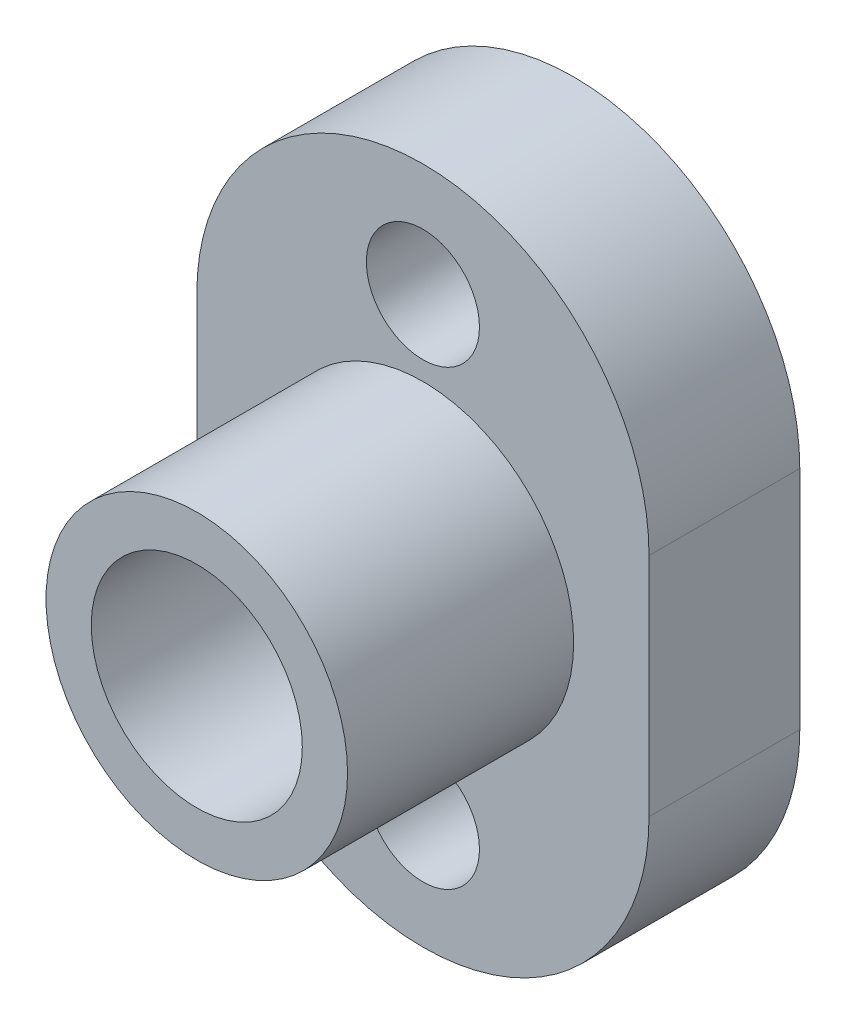
ISO-10303-21;
HEADER;
FILE_DESCRIPTION(('STEP AP214'),'2;1');
FILE_NAME('part.step','',(''),(''),'','','');
FILE_SCHEMA(('AUTOMOTIVE_DESIGN { 1 0 10303 214 1 1 1 1 }'));
ENDSEC;
DATA;
#1=APPLICATION_CONTEXT('core data for automotive mechanical design processes');
#2=APPLICATION_PROTOCOL_DEFINITION('international standard','automotive_design',2000,#1);
#3=PRODUCT_CONTEXT('',#1,'mechanical');
#4=PRODUCT('Part','Part','',(#3));
#5=PRODUCT_RELATED_PRODUCT_CATEGORY('part','',(#4));
#6=PRODUCT_DEFINITION_FORMATION('','',#4);
#7=PRODUCT_DEFINITION_CONTEXT('part definition',#1,'design');
#8=PRODUCT_DEFINITION('design','',#6,#7);
#9=PRODUCT_DEFINITION_SHAPE('','',#8);
#10=(LENGTH_UNIT() NAMED_UNIT(*) SI_UNIT(.MILLI.,.METRE.));
#11=(NAMED_UNIT(*) PLANE_ANGLE_UNIT() SI_UNIT($,.RADIAN.));
#12=(NAMED_UNIT(*) SI_UNIT($,.STERADIAN.) SOLID_ANGLE_UNIT());
#13=UNCERTAINTY_MEASURE_WITH_UNIT(LENGTH_MEASURE(1.E-05),#10,'distance_accuracy_value','');
#14=(GEOMETRIC_REPRESENTATION_CONTEXT(3) GLOBAL_UNCERTAINTY_ASSIGNED_CONTEXT((#13)) GLOBAL_UNIT_ASSIGNED_CONTEXT((#10,
#11,#12)) REPRESENTATION_CONTEXT('',''));
#15=CARTESIAN_POINT('',(0.,0.,0.));
#16=DIRECTION('',(0.,0.,1.));
#17=DIRECTION('',(1.,0.,0.));
#18=AXIS2_PLACEMENT_3D('',#15,#16,#17);
#19=CARTESIAN_POINT('',(0.,0.,4.));
#20=DIRECTION('',(0.,0.,1.));
#21=DIRECTION('',(1.,0.,0.));
#22=AXIS2_PLACEMENT_3D('',#19,#20,#21);
#23=PLANE('',#22);
#24=CARTESIAN_POINT('',(0.,-6.,4.));
#25=DIRECTION('',(0.,0.,1.));
#26=DIRECTION('',(1.,0.,0.));
#27=AXIS2_PLACEMENT_3D('',#24,#25,#26);
#28=CIRCLE('',#27,1.5);
#29=CARTESIAN_POINT('',(1.5,-6.,4.));
#30=VERTEX_POINT('',#29);
#31=EDGE_CURVE('E116',#30,#30,#28,.T.);
#32=ORIENTED_EDGE('',*,*,#31,.F.);
#33=EDGE_LOOP('',(#32));
#34=FACE_BOUND('',#33,.T.);
#35=CARTESIAN_POINT('',(0.,6.,4.));
#36=DIRECTION('',(0.,0.,1.));
#37=DIRECTION('',(1.,0.,0.));
#38=AXIS2_PLACEMENT_3D('',#35,#36,#37);
#39=CIRCLE('',#38,1.5);
#40=CARTESIAN_POINT('',(1.5,6.,4.));
#41=VERTEX_POINT('',#40);
#42=EDGE_CURVE('E109',#41,#41,#39,.F.);
#43=ORIENTED_EDGE('',*,*,#42,.T.);
#44=EDGE_LOOP('',(#43));
#45=FACE_BOUND('',#44,.T.);
#46=DIRECTION('',(0.,-1.,0.));
#47=VECTOR('',#46,1.);
#48=CARTESIAN_POINT('',(-6.,0.,4.));
#49=LINE('',#48,#47);
#50=CARTESIAN_POINT('',(-6.,3.,4.));
#51=VERTEX_POINT('',#50);
#52=CARTESIAN_POINT('',(-6.,-3.,4.));
#53=VERTEX_POINT('',#52);
#54=EDGE_CURVE('E94',#51,#53,#49,.T.);
#55=ORIENTED_EDGE('',*,*,#54,.T.);
#56=CARTESIAN_POINT('',(0.,-3.,4.));
#57=DIRECTION('',(0.,0.,1.));
#58=DIRECTION('',(1.,0.,0.));
#59=AXIS2_PLACEMENT_3D('',#56,#57,#58);
#60=CIRCLE('',#59,6.);
#61=CARTESIAN_POINT('',(6.,-3.,4.));
#62=VERTEX_POINT('',#61);
#63=EDGE_CURVE('E86',#53,#62,#60,.T.);
#64=ORIENTED_EDGE('',*,*,#63,.T.);
#65=DIRECTION('',(0.,-1.,0.));
#66=VECTOR('',#65,1.);
#67=CARTESIAN_POINT('',(6.,0.,4.));
#68=LINE('',#67,#66);
#69=CARTESIAN_POINT('',(6.,3.,4.));
#70=VERTEX_POINT('',#69);
#71=EDGE_CURVE('E93',#70,#62,#68,.T.);
#72=ORIENTED_EDGE('',*,*,#71,.F.);
#73=CARTESIAN_POINT('',(0.,3.,4.));
#74=DIRECTION('',(0.,0.,1.));
#75=DIRECTION('',(1.,0.,0.));
#76=AXIS2_PLACEMENT_3D('',#73,#74,#75);
#77=CIRCLE('',#76,6.);
#78=EDGE_CURVE('E106',#51,#70,#77,.F.);
#79=ORIENTED_EDGE('',*,*,#78,.F.);
#80=EDGE_LOOP('',(#55,#64,#72,#79));
#81=FACE_BOUND('',#80,.T.);
#82=CARTESIAN_POINT('',(0.,0.,4.));
#83=DIRECTION('',(0.,0.,1.));
#84=DIRECTION('',(1.,0.,0.));
#85=AXIS2_PLACEMENT_3D('',#82,#83,#84);
#86=CIRCLE('',#85,4.);
#87=CARTESIAN_POINT('',(4.,0.,4.));
#88=VERTEX_POINT('',#87);
#89=EDGE_CURVE('E123',#88,#88,#86,.F.);
#90=ORIENTED_EDGE('',*,*,#89,.T.);
#91=EDGE_LOOP('',(#90));
#92=FACE_BOUND('',#91,.T.);
#93=ADVANCED_FACE('F43',(#34,#45,#81,#92),#23,.T.);
#94=CARTESIAN_POINT('',(-6.,0.,4.));
#95=DIRECTION('',(1.,0.,0.));
#96=DIRECTION('',(0.,0.,-1.));
#97=AXIS2_PLACEMENT_3D('',#94,#95,#96);
#98=PLANE('',#97);
#99=DIRECTION('',(0.,-1.,0.));
#100=VECTOR('',#99,1.);
#101=CARTESIAN_POINT('',(-6.,0.,0.));
#102=LINE('',#101,#100);
#103=CARTESIAN_POINT('',(-6.,3.,0.));
#104=VERTEX_POINT('',#103);
#105=CARTESIAN_POINT('',(-6.,-3.,0.));
#106=VERTEX_POINT('',#105);
#107=EDGE_CURVE('E120',#104,#106,#102,.T.);
#108=ORIENTED_EDGE('',*,*,#107,.T.);
#109=DIRECTION('',(0.,0.,-1.));
#110=VECTOR('',#109,1.);
#111=CARTESIAN_POINT('',(-6.,-3.,4.));
#112=LINE('',#111,#110);
#113=EDGE_CURVE('E11',#53,#106,#112,.T.);
#114=ORIENTED_EDGE('',*,*,#113,.F.);
#115=ORIENTED_EDGE('',*,*,#54,.F.);
#116=DIRECTION('',(0.,0.,-1.));
#117=VECTOR('',#116,1.);
#118=CARTESIAN_POINT('',(-6.,3.,4.));
#119=LINE('',#118,#117);
#120=EDGE_CURVE('E61',#51,#104,#119,.T.);
#121=ORIENTED_EDGE('',*,*,#120,.T.);
#122=EDGE_LOOP('',(#108,#114,#115,#121));
#123=FACE_BOUND('',#122,.T.);
#124=ADVANCED_FACE('F45',(#123),#98,.F.);
#125=CARTESIAN_POINT('',(0.,-3.,4.));
#126=DIRECTION('',(0.,0.,-1.));
#127=DIRECTION('',(-1.,0.,0.));
#128=AXIS2_PLACEMENT_3D('',#125,#126,#127);
#129=CYLINDRICAL_SURFACE('',#128,6.);
#130=CARTESIAN_POINT('',(0.,-3.,0.));
#131=DIRECTION('',(0.,0.,1.));
#132=DIRECTION('',(1.,0.,0.));
#133=AXIS2_PLACEMENT_3D('',#130,#131,#132);
#134=CIRCLE('',#133,6.);
#135=CARTESIAN_POINT('',(6.,-3.,0.));
#136=VERTEX_POINT('',#135);
#137=EDGE_CURVE('E100',#106,#136,#134,.T.);
#138=ORIENTED_EDGE('',*,*,#137,.T.);
#139=DIRECTION('',(0.,0.,-1.));
#140=VECTOR('',#139,1.);
#141=CARTESIAN_POINT('',(6.,-3.,4.));
#142=LINE('',#141,#140);
#143=EDGE_CURVE('E53',#62,#136,#142,.T.);
#144=ORIENTED_EDGE('',*,*,#143,.F.);
#145=ORIENTED_EDGE('',*,*,#63,.F.);
#146=ORIENTED_EDGE('',*,*,#113,.T.);
#147=EDGE_LOOP('',(#138,#144,#145,#146));
#148=FACE_BOUND('',#147,.T.);
#149=ADVANCED_FACE('F99',(#148),#129,.T.);
#150=CARTESIAN_POINT('',(6.,0.,4.));
#151=DIRECTION('',(1.,0.,0.));
#152=DIRECTION('',(0.,0.,-1.));
#153=AXIS2_PLACEMENT_3D('',#150,#151,#152);
#154=PLANE('',#153);
#155=DIRECTION('',(0.,-1.,0.));
#156=VECTOR('',#155,1.);
#157=CARTESIAN_POINT('',(6.,0.,0.));
#158=LINE('',#157,#156);
#159=CARTESIAN_POINT('',(6.,3.,0.));
#160=VERTEX_POINT('',#159);
#161=EDGE_CURVE('E126',#160,#136,#158,.T.);
#162=ORIENTED_EDGE('',*,*,#161,.F.);
#163=DIRECTION('',(0.,0.,-1.));
#164=VECTOR('',#163,1.);
#165=CARTESIAN_POINT('',(6.,3.,4.));
#166=LINE('',#165,#164);
#167=EDGE_CURVE('E75',#70,#160,#166,.T.);
#168=ORIENTED_EDGE('',*,*,#167,.F.);
#169=ORIENTED_EDGE('',*,*,#71,.T.);
#170=ORIENTED_EDGE('',*,*,#143,.T.);
#171=EDGE_LOOP('',(#162,#168,#169,#170));
#172=FACE_BOUND('',#171,.T.);
#173=ADVANCED_FACE('F104',(#172),#154,.T.);
#174=CARTESIAN_POINT('',(0.,-6.,4.));
#175=DIRECTION('',(0.,0.,-1.));
#176=DIRECTION('',(-1.,0.,0.));
#177=AXIS2_PLACEMENT_3D('',#174,#175,#176);
#178=CYLINDRICAL_SURFACE('',#177,1.5);
#179=ORIENTED_EDGE('',*,*,#31,.T.);
#180=EDGE_LOOP('',(#179));
#181=FACE_BOUND('',#180,.T.);
#182=CARTESIAN_POINT('',(0.,-6.,0.));
#183=DIRECTION('',(0.,0.,1.));
#184=DIRECTION('',(1.,0.,0.));
#185=AXIS2_PLACEMENT_3D('',#182,#183,#184);
#186=CIRCLE('',#185,1.5);
#187=CARTESIAN_POINT('',(1.5,-6.,0.));
#188=VERTEX_POINT('',#187);
#189=EDGE_CURVE('E137',#188,#188,#186,.T.);
#190=ORIENTED_EDGE('',*,*,#189,.F.);
#191=EDGE_LOOP('',(#190));
#192=FACE_BOUND('',#191,.T.);
#193=ADVANCED_FACE('F193',(#181,#192),#178,.F.);
#194=CARTESIAN_POINT('',(0.,6.,4.));
#195=DIRECTION('',(0.,0.,-1.));
#196=DIRECTION('',(-1.,0.,0.));
#197=AXIS2_PLACEMENT_3D('',#194,#195,#196);
#198=CYLINDRICAL_SURFACE('',#197,1.5);
#199=ORIENTED_EDGE('',*,*,#42,.F.);
#200=EDGE_LOOP('',(#199));
#201=FACE_BOUND('',#200,.T.);
#202=CARTESIAN_POINT('',(0.,6.,0.));
#203=DIRECTION('',(0.,0.,1.));
#204=DIRECTION('',(1.,0.,0.));
#205=AXIS2_PLACEMENT_3D('',#202,#203,#204);
#206=CIRCLE('',#205,1.5);
#207=CARTESIAN_POINT('',(1.5,6.,0.));
#208=VERTEX_POINT('',#207);
#209=EDGE_CURVE('E133',#208,#208,#206,.F.);
#210=ORIENTED_EDGE('',*,*,#209,.T.);
#211=EDGE_LOOP('',(#210));
#212=FACE_BOUND('',#211,.T.);
#213=ADVANCED_FACE('F196',(#201,#212),#198,.F.);
#214=CARTESIAN_POINT('',(0.,3.,4.));
#215=DIRECTION('',(0.,0.,-1.));
#216=DIRECTION('',(-1.,0.,0.));
#217=AXIS2_PLACEMENT_3D('',#214,#215,#216);
#218=CYLINDRICAL_SURFACE('',#217,6.);
#219=CARTESIAN_POINT('',(0.,3.,0.));
#220=DIRECTION('',(0.,0.,1.));
#221=DIRECTION('',(1.,0.,0.));
#222=AXIS2_PLACEMENT_3D('',#219,#220,#221);
#223=CIRCLE('',#222,6.);
#224=EDGE_CURVE('E129',#104,#160,#223,.F.);
#225=ORIENTED_EDGE('',*,*,#224,.F.);
#226=ORIENTED_EDGE('',*,*,#120,.F.);
#227=ORIENTED_EDGE('',*,*,#78,.T.);
#228=ORIENTED_EDGE('',*,*,#167,.T.);
#229=EDGE_LOOP('',(#225,#226,#227,#228));
#230=FACE_BOUND('',#229,.T.);
#231=ADVANCED_FACE('F191',(#230),#218,.T.);
#232=CARTESIAN_POINT('',(0.,0.,4.));
#233=DIRECTION('',(0.,0.,-1.));
#234=DIRECTION('',(-1.,0.,0.));
#235=AXIS2_PLACEMENT_3D('',#232,#233,#234);
#236=CYLINDRICAL_SURFACE('',#235,2.8);
#237=CARTESIAN_POINT('',(0.,0.,0.));
#238=DIRECTION('',(0.,0.,1.));
#239=DIRECTION('',(1.,0.,0.));
#240=AXIS2_PLACEMENT_3D('',#237,#238,#239);
#241=CIRCLE('',#240,2.8);
#242=CARTESIAN_POINT('',(2.8,0.,0.));
#243=VERTEX_POINT('',#242);
#244=EDGE_CURVE('E141',#243,#243,#241,.T.);
#245=ORIENTED_EDGE('',*,*,#244,.F.);
#246=EDGE_LOOP('',(#245));
#247=FACE_BOUND('',#246,.T.);
#248=CARTESIAN_POINT('',(0.,0.,10.));
#249=DIRECTION('',(0.,0.,1.));
#250=DIRECTION('',(1.,0.,0.));
#251=AXIS2_PLACEMENT_3D('',#248,#249,#250);
#252=CIRCLE('',#251,2.8);
#253=CARTESIAN_POINT('',(2.8,0.,10.));
#254=VERTEX_POINT('',#253);
#255=EDGE_CURVE('E155',#254,#254,#252,.T.);
#256=ORIENTED_EDGE('',*,*,#255,.T.);
#257=EDGE_LOOP('',(#256));
#258=FACE_BOUND('',#257,.T.);
#259=ADVANCED_FACE('F177',(#247,#258),#236,.F.);
#260=CARTESIAN_POINT('',(0.,0.,0.));
#261=DIRECTION('',(0.,0.,1.));
#262=DIRECTION('',(1.,0.,0.));
#263=AXIS2_PLACEMENT_3D('',#260,#261,#262);
#264=PLANE('',#263);
#265=ORIENTED_EDGE('',*,*,#244,.T.);
#266=EDGE_LOOP('',(#265));
#267=FACE_BOUND('',#266,.T.);
#268=ORIENTED_EDGE('',*,*,#189,.T.);
#269=EDGE_LOOP('',(#268));
#270=FACE_BOUND('',#269,.T.);
#271=ORIENTED_EDGE('',*,*,#209,.F.);
#272=EDGE_LOOP('',(#271));
#273=FACE_BOUND('',#272,.T.);
#274=ORIENTED_EDGE('',*,*,#107,.F.);
#275=ORIENTED_EDGE('',*,*,#224,.T.);
#276=ORIENTED_EDGE('',*,*,#161,.T.);
#277=ORIENTED_EDGE('',*,*,#137,.F.);
#278=EDGE_LOOP('',(#274,#275,#276,#277));
#279=FACE_BOUND('',#278,.T.);
#280=ADVANCED_FACE('F169',(#267,#270,#273,#279),#264,.F.);
#281=CARTESIAN_POINT('',(0.,0.,10.));
#282=DIRECTION('',(0.,0.,-1.));
#283=DIRECTION('',(-1.,0.,0.));
#284=AXIS2_PLACEMENT_3D('',#281,#282,#283);
#285=CYLINDRICAL_SURFACE('',#284,4.);
#286=ORIENTED_EDGE('',*,*,#89,.F.);
#287=EDGE_LOOP('',(#286));
#288=FACE_BOUND('',#287,.T.);
#289=CARTESIAN_POINT('',(0.,0.,10.));
#290=DIRECTION('',(0.,0.,1.));
#291=DIRECTION('',(1.,0.,0.));
#292=AXIS2_PLACEMENT_3D('',#289,#290,#291);
#293=CIRCLE('',#292,4.);
#294=CARTESIAN_POINT('',(4.,0.,10.));
#295=VERTEX_POINT('',#294);
#296=EDGE_CURVE('E159',#295,#295,#293,.T.);
#297=ORIENTED_EDGE('',*,*,#296,.F.);
#298=EDGE_LOOP('',(#297));
#299=FACE_BOUND('',#298,.T.);
#300=ADVANCED_FACE('F167',(#288,#299),#285,.T.);
#301=CARTESIAN_POINT('',(0.,0.,10.));
#302=DIRECTION('',(0.,0.,1.));
#303=DIRECTION('',(1.,0.,0.));
#304=AXIS2_PLACEMENT_3D('',#301,#302,#303);
#305=PLANE('',#304);
#306=ORIENTED_EDGE('',*,*,#296,.T.);
#307=EDGE_LOOP('',(#306));
#308=FACE_BOUND('',#307,.T.);
#309=ORIENTED_EDGE('',*,*,#255,.F.);
#310=EDGE_LOOP('',(#309));
#311=FACE_BOUND('',#310,.T.);
#312=ADVANCED_FACE('F164',(#308,#311),#305,.T.);
#313=CLOSED_SHELL('',(#93,#124,#149,#173,#193,#213,#231,#259,#280,#300,#312));
#314=MANIFOLD_SOLID_BREP('B2',#313);
#315=ADVANCED_BREP_SHAPE_REPRESENTATION('',(#18,#314),#14);
#316=SHAPE_DEFINITION_REPRESENTATION(#9,#315);
ENDSEC;
END-ISO-10303-21;
